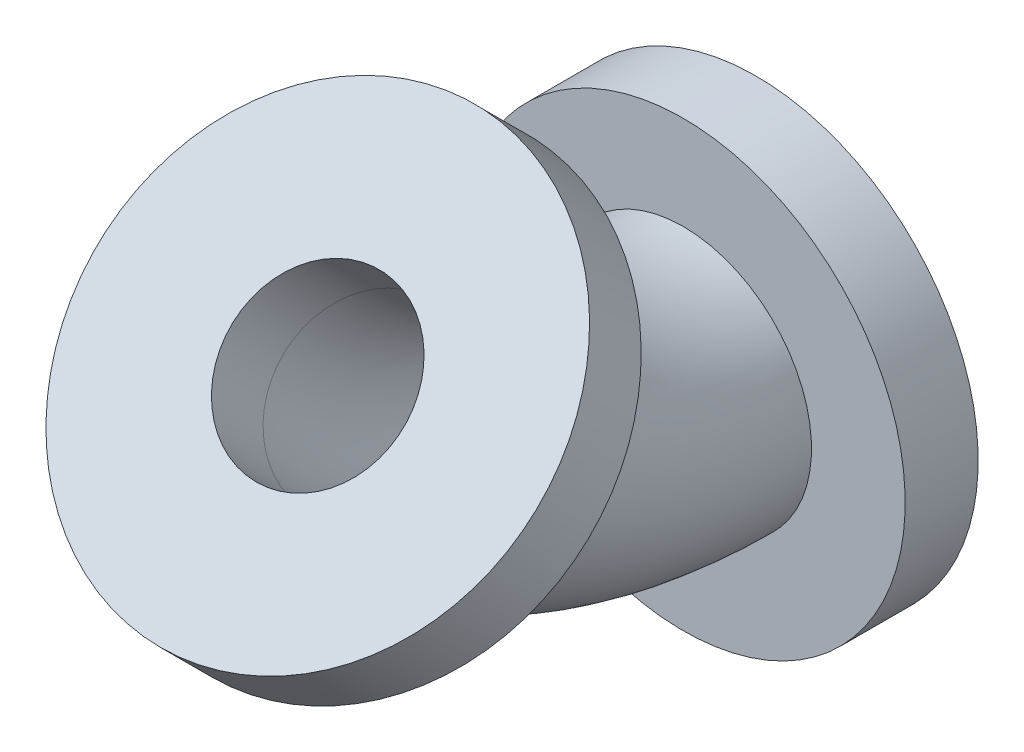
ISO-10303-21;
HEADER;
FILE_DESCRIPTION(('STEP AP214'),'2;1');
FILE_NAME('part.step','',(''),(''),'','','');
FILE_SCHEMA(('AUTOMOTIVE_DESIGN { 1 0 10303 214 1 1 1 1 }'));
ENDSEC;
DATA;
#1=APPLICATION_CONTEXT('core data for automotive mechanical design processes');
#2=APPLICATION_PROTOCOL_DEFINITION('international standard','automotive_design',2000,#1);
#3=PRODUCT_CONTEXT('',#1,'mechanical');
#4=PRODUCT('Part','Part','',(#3));
#5=PRODUCT_RELATED_PRODUCT_CATEGORY('part','',(#4));
#6=PRODUCT_DEFINITION_FORMATION('','',#4);
#7=PRODUCT_DEFINITION_CONTEXT('part definition',#1,'design');
#8=PRODUCT_DEFINITION('design','',#6,#7);
#9=PRODUCT_DEFINITION_SHAPE('','',#8);
#10=(LENGTH_UNIT() NAMED_UNIT(*) SI_UNIT(.MILLI.,.METRE.));
#11=(NAMED_UNIT(*) PLANE_ANGLE_UNIT() SI_UNIT($,.RADIAN.));
#12=(NAMED_UNIT(*) SI_UNIT($,.STERADIAN.) SOLID_ANGLE_UNIT());
#13=UNCERTAINTY_MEASURE_WITH_UNIT(LENGTH_MEASURE(1.E-05),#10,'distance_accuracy_value','');
#14=(GEOMETRIC_REPRESENTATION_CONTEXT(3) GLOBAL_UNCERTAINTY_ASSIGNED_CONTEXT((#13)) GLOBAL_UNIT_ASSIGNED_CONTEXT((#10,
#11,#12)) REPRESENTATION_CONTEXT('',''));
#15=CARTESIAN_POINT('',(0.,0.,0.));
#16=DIRECTION('',(0.,0.,1.));
#17=DIRECTION('',(1.,0.,0.));
#18=AXIS2_PLACEMENT_3D('',#15,#16,#17);
#19=CARTESIAN_POINT('',(0.,0.,0.));
#20=DIRECTION('',(0.,0.,1.));
#21=DIRECTION('',(1.,0.,0.));
#22=AXIS2_PLACEMENT_3D('',#19,#20,#21);
#23=PLANE('',#22);
#24=CARTESIAN_POINT('',(0.,0.,0.));
#25=DIRECTION('',(0.,0.,1.));
#26=DIRECTION('',(1.,0.,0.));
#27=AXIS2_PLACEMENT_3D('',#24,#25,#26);
#28=CIRCLE('',#27,44.);
#29=CARTESIAN_POINT('',(44.,0.,0.));
#30=VERTEX_POINT('',#29);
#31=EDGE_CURVE('E57',#30,#30,#28,.T.);
#32=ORIENTED_EDGE('',*,*,#31,.T.);
#33=EDGE_LOOP('',(#32));
#34=FACE_BOUND('',#33,.T.);
#35=CARTESIAN_POINT('',(0.,0.,0.));
#36=DIRECTION('',(0.,0.,-1.));
#37=DIRECTION('',(-1.,0.,0.));
#38=AXIS2_PLACEMENT_3D('',#35,#36,#37);
#39=CIRCLE('',#38,65.);
#40=CARTESIAN_POINT('',(-65.,0.,0.));
#41=VERTEX_POINT('',#40);
#42=EDGE_CURVE('E77',#41,#41,#39,.T.);
#43=ORIENTED_EDGE('',*,*,#42,.T.);
#44=EDGE_LOOP('',(#43));
#45=FACE_BOUND('',#44,.T.);
#46=ADVANCED_FACE('F37',(#34,#45),#23,.F.);
#47=CARTESIAN_POINT('',(0.,0.,47.));
#48=DIRECTION('',(0.,0.,-1.));
#49=DIRECTION('',(-1.,0.,0.));
#50=AXIS2_PLACEMENT_3D('',#47,#48,#49);
#51=CYLINDRICAL_SURFACE('',#50,112.5);
#52=CARTESIAN_POINT('',(0.,0.,47.));
#53=DIRECTION('',(0.,0.,-1.));
#54=DIRECTION('',(-1.,0.,0.));
#55=AXIS2_PLACEMENT_3D('',#52,#53,#54);
#56=CIRCLE('',#55,112.5);
#57=CARTESIAN_POINT('',(-112.5,0.,47.));
#58=VERTEX_POINT('',#57);
#59=EDGE_CURVE('E68',#58,#58,#56,.T.);
#60=ORIENTED_EDGE('',*,*,#59,.T.);
#61=EDGE_LOOP('',(#60));
#62=FACE_BOUND('',#61,.T.);
#63=CARTESIAN_POINT('',(0.,0.,10.));
#64=DIRECTION('',(0.,0.,-1.));
#65=DIRECTION('',(-1.,0.,0.));
#66=AXIS2_PLACEMENT_3D('',#63,#64,#65);
#67=CIRCLE('',#66,112.5);
#68=CARTESIAN_POINT('',(-112.5,0.,10.));
#69=VERTEX_POINT('',#68);
#70=EDGE_CURVE('E72',#69,#69,#67,.T.);
#71=ORIENTED_EDGE('',*,*,#70,.F.);
#72=EDGE_LOOP('',(#71));
#73=FACE_BOUND('',#72,.T.);
#74=ADVANCED_FACE('F105',(#62,#73),#51,.T.);
#75=CARTESIAN_POINT('',(0.,92.0639251369293,232.261976670876));
#76=DIRECTION('',(0.,0.707106781186547,0.707106781186548));
#77=DIRECTION('',(1.,0.,0.));
#78=AXIS2_PLACEMENT_3D('',#75,#76,#77);
#79=PLANE('',#78);
#80=CARTESIAN_POINT('',(0.,92.0639251369293,232.261976670876));
#81=DIRECTION('',(0.,0.707106781186547,0.707106781186548));
#82=DIRECTION('',(0.,-0.707106781186548,0.707106781186547));
#83=AXIS2_PLACEMENT_3D('',#80,#81,#82);
#84=CIRCLE('',#83,44.);
#85=CARTESIAN_POINT('',(0.,60.9512267647212,263.374675043084));
#86=VERTEX_POINT('',#85);
#87=EDGE_CURVE('E44',#86,#86,#84,.T.);
#88=ORIENTED_EDGE('',*,*,#87,.F.);
#89=EDGE_LOOP('',(#88));
#90=FACE_BOUND('',#89,.T.);
#91=CARTESIAN_POINT('',(0.,92.0639251369293,232.261976670876));
#92=DIRECTION('',(0.,0.707106781186547,0.707106781186548));
#93=DIRECTION('',(0.,-0.707106781186548,0.707106781186547));
#94=AXIS2_PLACEMENT_3D('',#91,#92,#93);
#95=CIRCLE('',#94,112.5);
#96=CARTESIAN_POINT('',(0.,12.5144122534427,311.811489554362));
#97=VERTEX_POINT('',#96);
#98=EDGE_CURVE('E85',#97,#97,#95,.T.);
#99=ORIENTED_EDGE('',*,*,#98,.T.);
#100=EDGE_LOOP('',(#99));
#101=FACE_BOUND('',#100,.T.);
#102=ADVANCED_FACE('F110',(#90,#101),#79,.T.);
#103=CARTESIAN_POINT('',(0.,225.,47.));
#104=DIRECTION('',(-1.,0.,0.));
#105=DIRECTION('',(0.,0.,1.));
#106=AXIS2_PLACEMENT_3D('',#103,#104,#105);
#107=TOROIDAL_SURFACE('',#106,225.,65.);
#108=CARTESIAN_POINT('',(0.,0.,47.));
#109=DIRECTION('',(0.,0.,-1.));
#110=DIRECTION('',(-1.,0.,0.));
#111=AXIS2_PLACEMENT_3D('',#108,#109,#110);
#112=CIRCLE('',#111,65.);
#113=CARTESIAN_POINT('',(0.,-65.,47.));
#114=VERTEX_POINT('',#113);
#115=EDGE_CURVE('E60',#114,#114,#112,.F.);
#116=CARTESIAN_POINT('',(0.,65.9009742330269,206.099025766973));
#117=DIRECTION('',(0.,0.707106781186548,0.707106781186547));
#118=DIRECTION('',(1.,0.,0.));
#119=AXIS2_PLACEMENT_3D('',#116,#117,#118);
#120=CIRCLE('',#119,65.);
#121=CARTESIAN_POINT('',(0.,19.9390334559014,252.060966544099));
#122=VERTEX_POINT('',#121);
#123=EDGE_CURVE('E10',#122,#122,#120,.T.);
#124=CARTESIAN_POINT('',(0.,225.,47.));
#125=DIRECTION('',(-1.,0.,0.));
#126=DIRECTION('',(0.,0.,1.));
#127=AXIS2_PLACEMENT_3D('',#124,#125,#126);
#128=CIRCLE('',#127,290.);
#129=EDGE_CURVE('',#114,#122,#128,.T.);
#130=ORIENTED_EDGE('',*,*,#115,.T.);
#131=ORIENTED_EDGE('',*,*,#123,.F.);
#132=ORIENTED_EDGE('',*,*,#129,.T.);
#133=ORIENTED_EDGE('',*,*,#129,.F.);
#134=EDGE_LOOP('',(#130,#132,#131,#133));
#135=FACE_BOUND('',#134,.T.);
#136=ADVANCED_FACE('F113',(#135),#107,.T.);
#137=CARTESIAN_POINT('',(0.,0.,0.));
#138=DIRECTION('',(0.,0.,1.));
#139=DIRECTION('',(1.,0.,0.));
#140=AXIS2_PLACEMENT_3D('',#137,#138,#139);
#141=CYLINDRICAL_SURFACE('',#140,44.);
#142=CARTESIAN_POINT('',(0.,0.,47.));
#143=DIRECTION('',(0.,0.,-1.));
#144=DIRECTION('',(0.,1.,0.));
#145=AXIS2_PLACEMENT_3D('',#142,#143,#144);
#146=CIRCLE('',#145,44.);
#147=CARTESIAN_POINT('',(0.,-44.,47.));
#148=VERTEX_POINT('',#147);
#149=EDGE_CURVE('E54',#148,#148,#146,.F.);
#150=ORIENTED_EDGE('',*,*,#149,.T.);
#151=EDGE_LOOP('',(#150));
#152=FACE_BOUND('',#151,.T.);
#153=ORIENTED_EDGE('',*,*,#31,.F.);
#154=EDGE_LOOP('',(#153));
#155=FACE_BOUND('',#154,.T.);
#156=ADVANCED_FACE('F132',(#152,#155),#141,.F.);
#157=CARTESIAN_POINT('',(0.,225.,47.));
#158=DIRECTION('',(-1.,0.,0.));
#159=DIRECTION('',(0.,0.,1.));
#160=AXIS2_PLACEMENT_3D('',#157,#158,#159);
#161=TOROIDAL_SURFACE('',#160,225.,44.);
#162=CARTESIAN_POINT('',(0.,65.9009742330269,206.099025766973));
#163=DIRECTION('',(0.,0.707106781186547,0.707106781186548));
#164=DIRECTION('',(0.,-0.707106781186548,0.707106781186547));
#165=AXIS2_PLACEMENT_3D('',#162,#163,#164);
#166=CIRCLE('',#165,44.);
#167=CARTESIAN_POINT('',(0.,34.7882758608189,237.211724139181));
#168=VERTEX_POINT('',#167);
#169=EDGE_CURVE('E49',#168,#168,#166,.T.);
#170=CARTESIAN_POINT('',(0.,225.,47.));
#171=DIRECTION('',(-1.,0.,0.));
#172=DIRECTION('',(0.,0.,1.));
#173=AXIS2_PLACEMENT_3D('',#170,#171,#172);
#174=CIRCLE('',#173,269.);
#175=EDGE_CURVE('',#148,#168,#174,.T.);
#176=ORIENTED_EDGE('',*,*,#149,.F.);
#177=ORIENTED_EDGE('',*,*,#169,.T.);
#178=ORIENTED_EDGE('',*,*,#175,.T.);
#179=ORIENTED_EDGE('',*,*,#175,.F.);
#180=EDGE_LOOP('',(#176,#178,#177,#179));
#181=FACE_BOUND('',#180,.T.);
#182=ADVANCED_FACE('F136',(#181),#161,.F.);
#183=CARTESIAN_POINT('',(0.,65.9009742330269,206.099025766973));
#184=DIRECTION('',(0.,0.707106781186547,0.707106781186548));
#185=DIRECTION('',(0.,-0.707106781186548,0.707106781186547));
#186=AXIS2_PLACEMENT_3D('',#183,#184,#185);
#187=CYLINDRICAL_SURFACE('',#186,44.);
#188=ORIENTED_EDGE('',*,*,#87,.T.);
#189=EDGE_LOOP('',(#188));
#190=FACE_BOUND('',#189,.T.);
#191=ORIENTED_EDGE('',*,*,#169,.F.);
#192=EDGE_LOOP('',(#191));
#193=FACE_BOUND('',#192,.T.);
#194=ADVANCED_FACE('F130',(#190,#193),#187,.F.);
#195=CARTESIAN_POINT('',(0.,0.,47.));
#196=DIRECTION('',(0.,0.,-1.));
#197=DIRECTION('',(-1.,0.,0.));
#198=AXIS2_PLACEMENT_3D('',#195,#196,#197);
#199=PLANE('',#198);
#200=ORIENTED_EDGE('',*,*,#115,.F.);
#201=EDGE_LOOP('',(#200));
#202=FACE_BOUND('',#201,.T.);
#203=ORIENTED_EDGE('',*,*,#59,.F.);
#204=EDGE_LOOP('',(#203));
#205=FACE_BOUND('',#204,.T.);
#206=ADVANCED_FACE('F125',(#202,#205),#199,.F.);
#207=CARTESIAN_POINT('',(0.,0.,10.));
#208=DIRECTION('',(0.,0.,-1.));
#209=DIRECTION('',(-1.,0.,0.));
#210=AXIS2_PLACEMENT_3D('',#207,#208,#209);
#211=PLANE('',#210);
#212=CARTESIAN_POINT('',(0.,0.,10.));
#213=DIRECTION('',(0.,0.,-1.));
#214=DIRECTION('',(-1.,0.,0.));
#215=AXIS2_PLACEMENT_3D('',#212,#213,#214);
#216=CIRCLE('',#215,65.);
#217=CARTESIAN_POINT('',(-65.,0.,10.));
#218=VERTEX_POINT('',#217);
#219=EDGE_CURVE('E76',#218,#218,#216,.T.);
#220=ORIENTED_EDGE('',*,*,#219,.F.);
#221=EDGE_LOOP('',(#220));
#222=FACE_BOUND('',#221,.T.);
#223=ORIENTED_EDGE('',*,*,#70,.T.);
#224=EDGE_LOOP('',(#223));
#225=FACE_BOUND('',#224,.T.);
#226=ADVANCED_FACE('F119',(#222,#225),#211,.T.);
#227=CARTESIAN_POINT('',(0.,0.,10.));
#228=DIRECTION('',(0.,0.,-1.));
#229=DIRECTION('',(-1.,0.,0.));
#230=AXIS2_PLACEMENT_3D('',#227,#228,#229);
#231=CYLINDRICAL_SURFACE('',#230,65.);
#232=ORIENTED_EDGE('',*,*,#219,.T.);
#233=EDGE_LOOP('',(#232));
#234=FACE_BOUND('',#233,.T.);
#235=ORIENTED_EDGE('',*,*,#42,.F.);
#236=EDGE_LOOP('',(#235));
#237=FACE_BOUND('',#236,.T.);
#238=ADVANCED_FACE('F102',(#234,#237),#231,.T.);
#239=CARTESIAN_POINT('',(0.,65.9009742330271,206.099025766973));
#240=DIRECTION('',(0.,0.707106781186547,0.707106781186548));
#241=DIRECTION('',(0.,-0.707106781186548,0.707106781186547));
#242=AXIS2_PLACEMENT_3D('',#239,#240,#241);
#243=CYLINDRICAL_SURFACE('',#242,112.5);
#244=CARTESIAN_POINT('',(0.,65.9009742330271,206.099025766973));
#245=DIRECTION('',(0.,0.707106781186547,0.707106781186548));
#246=DIRECTION('',(0.,-0.707106781186548,0.707106781186547));
#247=AXIS2_PLACEMENT_3D('',#244,#245,#246);
#248=CIRCLE('',#247,112.5);
#249=CARTESIAN_POINT('',(0.,-13.6485386504596,285.64853865046));
#250=VERTEX_POINT('',#249);
#251=EDGE_CURVE('E81',#250,#250,#248,.T.);
#252=ORIENTED_EDGE('',*,*,#251,.T.);
#253=EDGE_LOOP('',(#252));
#254=FACE_BOUND('',#253,.T.);
#255=ORIENTED_EDGE('',*,*,#98,.F.);
#256=EDGE_LOOP('',(#255));
#257=FACE_BOUND('',#256,.T.);
#258=ADVANCED_FACE('F93',(#254,#257),#243,.T.);
#259=CARTESIAN_POINT('',(0.,65.9009742330271,206.099025766973));
#260=DIRECTION('',(0.,0.707106781186547,0.707106781186548));
#261=DIRECTION('',(0.,-0.707106781186548,0.707106781186547));
#262=AXIS2_PLACEMENT_3D('',#259,#260,#261);
#263=PLANE('',#262);
#264=ORIENTED_EDGE('',*,*,#123,.T.);
#265=EDGE_LOOP('',(#264));
#266=FACE_BOUND('',#265,.T.);
#267=ORIENTED_EDGE('',*,*,#251,.F.);
#268=EDGE_LOOP('',(#267));
#269=FACE_BOUND('',#268,.T.);
#270=ADVANCED_FACE('F96',(#266,#269),#263,.F.);
#271=CLOSED_SHELL('',(#46,#74,#102,#136,#156,#182,#194,#206,#226,#238,#258,#270));
#272=MANIFOLD_SOLID_BREP('B2',#271);
#273=ADVANCED_BREP_SHAPE_REPRESENTATION('',(#18,#272),#14);
#274=SHAPE_DEFINITION_REPRESENTATION(#9,#273);
ENDSEC;
END-ISO-10303-21;
